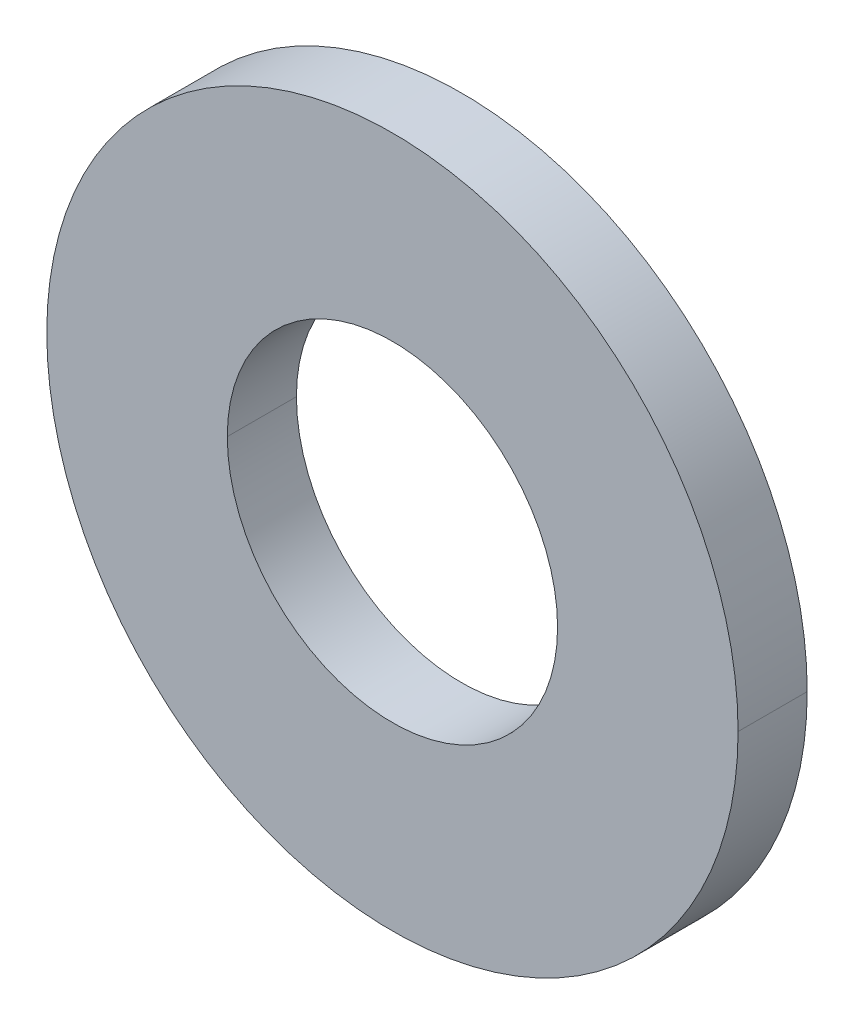
ISO-10303-21;
HEADER;
FILE_DESCRIPTION(('STEP AP214'),'2;1');
FILE_NAME('part.step','',(''),(''),'','','');
FILE_SCHEMA(('AUTOMOTIVE_DESIGN { 1 0 10303 214 1 1 1 1 }'));
ENDSEC;
DATA;
#1=APPLICATION_CONTEXT('core data for automotive mechanical design processes');
#2=APPLICATION_PROTOCOL_DEFINITION('international standard','automotive_design',2000,#1);
#3=PRODUCT_CONTEXT('',#1,'mechanical');
#4=PRODUCT('Part','Part','',(#3));
#5=PRODUCT_RELATED_PRODUCT_CATEGORY('part','',(#4));
#6=PRODUCT_DEFINITION_FORMATION('','',#4);
#7=PRODUCT_DEFINITION_CONTEXT('part definition',#1,'design');
#8=PRODUCT_DEFINITION('design','',#6,#7);
#9=PRODUCT_DEFINITION_SHAPE('','',#8);
#10=(LENGTH_UNIT() NAMED_UNIT(*) SI_UNIT(.MILLI.,.METRE.));
#11=(NAMED_UNIT(*) PLANE_ANGLE_UNIT() SI_UNIT($,.RADIAN.));
#12=(NAMED_UNIT(*) SI_UNIT($,.STERADIAN.) SOLID_ANGLE_UNIT());
#13=UNCERTAINTY_MEASURE_WITH_UNIT(LENGTH_MEASURE(1.E-05),#10,'distance_accuracy_value','');
#14=(GEOMETRIC_REPRESENTATION_CONTEXT(3) GLOBAL_UNCERTAINTY_ASSIGNED_CONTEXT((#13)) GLOBAL_UNIT_ASSIGNED_CONTEXT((#10,
#11,#12)) REPRESENTATION_CONTEXT('',''));
#15=CARTESIAN_POINT('',(0.,0.,0.));
#16=DIRECTION('',(0.,0.,1.));
#17=DIRECTION('',(1.,0.,0.));
#18=AXIS2_PLACEMENT_3D('',#15,#16,#17);
#19=CARTESIAN_POINT('',(0.,0.,0.9));
#20=DIRECTION('',(0.,0.,-1.));
#21=DIRECTION('',(-1.,0.,0.));
#22=AXIS2_PLACEMENT_3D('',#19,#20,#21);
#23=CYLINDRICAL_SURFACE('',#22,2.15);
#24=DIRECTION('',(0.,0.,-1.));
#25=VECTOR('',#24,1.);
#26=CARTESIAN_POINT('',(2.15,0.,0.9));
#27=LINE('',#26,#25);
#28=CARTESIAN_POINT('',(2.15,0.,0.9));
#29=VERTEX_POINT('',#28);
#30=CARTESIAN_POINT('',(2.15,0.,0.));
#31=VERTEX_POINT('',#30);
#32=EDGE_CURVE('E76',#29,#31,#27,.T.);
#33=ORIENTED_EDGE('',*,*,#32,.F.);
#34=CARTESIAN_POINT('',(0.,0.,0.9));
#35=DIRECTION('',(0.,0.,1.));
#36=DIRECTION('',(1.,0.,0.));
#37=AXIS2_PLACEMENT_3D('',#34,#35,#36);
#38=CIRCLE('',#37,2.15);
#39=CARTESIAN_POINT('',(-2.15,0.,0.9));
#40=VERTEX_POINT('',#39);
#41=EDGE_CURVE('E71',#29,#40,#38,.T.);
#42=ORIENTED_EDGE('',*,*,#41,.T.);
#43=DIRECTION('',(0.,0.,-1.));
#44=VECTOR('',#43,1.);
#45=CARTESIAN_POINT('',(-2.15,0.,0.9));
#46=LINE('',#45,#44);
#47=CARTESIAN_POINT('',(-2.15,0.,0.));
#48=VERTEX_POINT('',#47);
#49=EDGE_CURVE('E73',#40,#48,#46,.T.);
#50=ORIENTED_EDGE('',*,*,#49,.T.);
#51=CARTESIAN_POINT('',(0.,0.,0.));
#52=DIRECTION('',(0.,0.,1.));
#53=DIRECTION('',(1.,0.,0.));
#54=AXIS2_PLACEMENT_3D('',#51,#52,#53);
#55=CIRCLE('',#54,2.15);
#56=EDGE_CURVE('E10',#31,#48,#55,.T.);
#57=ORIENTED_EDGE('',*,*,#56,.F.);
#58=EDGE_LOOP('',(#33,#42,#50,#57));
#59=FACE_BOUND('',#58,.T.);
#60=ADVANCED_FACE('F15',(#59),#23,.F.);
#61=CARTESIAN_POINT('',(0.,0.,0.9));
#62=DIRECTION('',(0.,0.,-1.));
#63=DIRECTION('',(-1.,0.,0.));
#64=AXIS2_PLACEMENT_3D('',#61,#62,#63);
#65=CYLINDRICAL_SURFACE('',#64,4.5);
#66=DIRECTION('',(0.,0.,-1.));
#67=VECTOR('',#66,1.);
#68=CARTESIAN_POINT('',(4.5,0.,0.9));
#69=LINE('',#68,#67);
#70=CARTESIAN_POINT('',(4.5,0.,0.9));
#71=VERTEX_POINT('',#70);
#72=CARTESIAN_POINT('',(4.5,0.,0.));
#73=VERTEX_POINT('',#72);
#74=EDGE_CURVE('E107',#71,#73,#69,.T.);
#75=ORIENTED_EDGE('',*,*,#74,.F.);
#76=CARTESIAN_POINT('',(0.,0.,0.9));
#77=DIRECTION('',(0.,0.,1.));
#78=DIRECTION('',(1.,0.,0.));
#79=AXIS2_PLACEMENT_3D('',#76,#77,#78);
#80=CIRCLE('',#79,4.5);
#81=CARTESIAN_POINT('',(-4.5,0.,0.9));
#82=VERTEX_POINT('',#81);
#83=EDGE_CURVE('E81',#82,#71,#80,.T.);
#84=ORIENTED_EDGE('',*,*,#83,.F.);
#85=DIRECTION('',(0.,0.,-1.));
#86=VECTOR('',#85,1.);
#87=CARTESIAN_POINT('',(-4.5,0.,0.9));
#88=LINE('',#87,#86);
#89=CARTESIAN_POINT('',(-4.5,0.,0.));
#90=VERTEX_POINT('',#89);
#91=EDGE_CURVE('E18',#82,#90,#88,.T.);
#92=ORIENTED_EDGE('',*,*,#91,.T.);
#93=CARTESIAN_POINT('',(0.,0.,0.));
#94=DIRECTION('',(0.,0.,1.));
#95=DIRECTION('',(1.,0.,0.));
#96=AXIS2_PLACEMENT_3D('',#93,#94,#95);
#97=CIRCLE('',#96,4.5);
#98=EDGE_CURVE('E24',#90,#73,#97,.T.);
#99=ORIENTED_EDGE('',*,*,#98,.T.);
#100=EDGE_LOOP('',(#75,#84,#92,#99));
#101=FACE_BOUND('',#100,.T.);
#102=ADVANCED_FACE('F158',(#101),#65,.T.);
#103=CARTESIAN_POINT('',(0.,0.,0.));
#104=DIRECTION('',(0.,0.,1.));
#105=DIRECTION('',(1.,0.,0.));
#106=AXIS2_PLACEMENT_3D('',#103,#104,#105);
#107=PLANE('',#106);
#108=CARTESIAN_POINT('',(0.,0.,0.));
#109=DIRECTION('',(0.,0.,1.));
#110=DIRECTION('',(1.,0.,0.));
#111=AXIS2_PLACEMENT_3D('',#108,#109,#110);
#112=CIRCLE('',#111,2.15);
#113=EDGE_CURVE('E87',#48,#31,#112,.T.);
#114=ORIENTED_EDGE('',*,*,#113,.T.);
#115=ORIENTED_EDGE('',*,*,#56,.T.);
#116=EDGE_LOOP('',(#114,#115));
#117=FACE_BOUND('',#116,.T.);
#118=ORIENTED_EDGE('',*,*,#98,.F.);
#119=CARTESIAN_POINT('',(0.,0.,0.));
#120=DIRECTION('',(0.,0.,1.));
#121=DIRECTION('',(1.,0.,0.));
#122=AXIS2_PLACEMENT_3D('',#119,#120,#121);
#123=CIRCLE('',#122,4.5);
#124=EDGE_CURVE('E111',#73,#90,#123,.T.);
#125=ORIENTED_EDGE('',*,*,#124,.F.);
#126=EDGE_LOOP('',(#118,#125));
#127=FACE_BOUND('',#126,.T.);
#128=ADVANCED_FACE('F153',(#117,#127),#107,.F.);
#129=CARTESIAN_POINT('',(0.,0.,0.9));
#130=DIRECTION('',(0.,0.,1.));
#131=DIRECTION('',(1.,0.,0.));
#132=AXIS2_PLACEMENT_3D('',#129,#130,#131);
#133=PLANE('',#132);
#134=CARTESIAN_POINT('',(0.,0.,0.9));
#135=DIRECTION('',(0.,0.,1.));
#136=DIRECTION('',(1.,0.,0.));
#137=AXIS2_PLACEMENT_3D('',#134,#135,#136);
#138=CIRCLE('',#137,2.15);
#139=EDGE_CURVE('E85',#40,#29,#138,.T.);
#140=ORIENTED_EDGE('',*,*,#139,.F.);
#141=ORIENTED_EDGE('',*,*,#41,.F.);
#142=EDGE_LOOP('',(#140,#141));
#143=FACE_BOUND('',#142,.T.);
#144=ORIENTED_EDGE('',*,*,#83,.T.);
#145=CARTESIAN_POINT('',(0.,0.,0.9));
#146=DIRECTION('',(0.,0.,1.));
#147=DIRECTION('',(1.,0.,0.));
#148=AXIS2_PLACEMENT_3D('',#145,#146,#147);
#149=CIRCLE('',#148,4.5);
#150=EDGE_CURVE('E89',#71,#82,#149,.T.);
#151=ORIENTED_EDGE('',*,*,#150,.T.);
#152=EDGE_LOOP('',(#144,#151));
#153=FACE_BOUND('',#152,.T.);
#154=ADVANCED_FACE('F91',(#143,#153),#133,.T.);
#155=CARTESIAN_POINT('',(0.,0.,0.9));
#156=DIRECTION('',(0.,0.,-1.));
#157=DIRECTION('',(-1.,0.,0.));
#158=AXIS2_PLACEMENT_3D('',#155,#156,#157);
#159=CYLINDRICAL_SURFACE('',#158,4.5);
#160=ORIENTED_EDGE('',*,*,#150,.F.);
#161=ORIENTED_EDGE('',*,*,#74,.T.);
#162=ORIENTED_EDGE('',*,*,#124,.T.);
#163=ORIENTED_EDGE('',*,*,#91,.F.);
#164=EDGE_LOOP('',(#160,#161,#162,#163));
#165=FACE_BOUND('',#164,.T.);
#166=ADVANCED_FACE('F133',(#165),#159,.T.);
#167=CARTESIAN_POINT('',(0.,0.,0.9));
#168=DIRECTION('',(0.,0.,-1.));
#169=DIRECTION('',(-1.,0.,0.));
#170=AXIS2_PLACEMENT_3D('',#167,#168,#169);
#171=CYLINDRICAL_SURFACE('',#170,2.15);
#172=ORIENTED_EDGE('',*,*,#139,.T.);
#173=ORIENTED_EDGE('',*,*,#32,.T.);
#174=ORIENTED_EDGE('',*,*,#113,.F.);
#175=ORIENTED_EDGE('',*,*,#49,.F.);
#176=EDGE_LOOP('',(#172,#173,#174,#175));
#177=FACE_BOUND('',#176,.T.);
#178=ADVANCED_FACE('F84',(#177),#171,.F.);
#179=CLOSED_SHELL('',(#60,#102,#128,#154,#166,#178));
#180=MANIFOLD_SOLID_BREP('B1',#179);
#181=ADVANCED_BREP_SHAPE_REPRESENTATION('',(#18,#180),#14);
#182=SHAPE_DEFINITION_REPRESENTATION(#9,#181);
ENDSEC;
END-ISO-10303-21;
